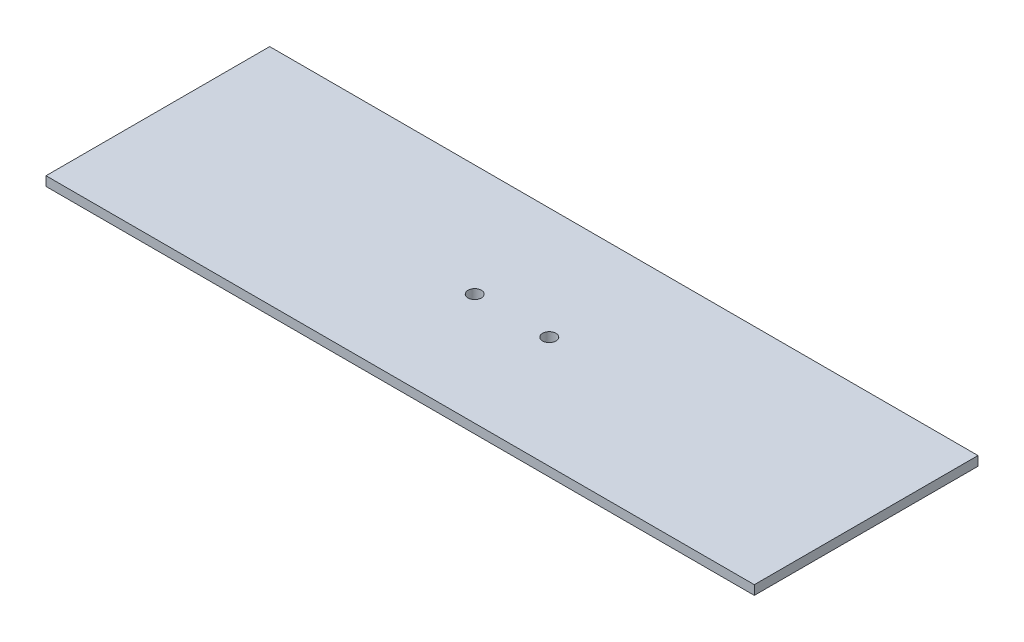
ISO-10303-21;
HEADER;
FILE_DESCRIPTION(('STEP AP214'),'2;1');
FILE_NAME('part.step','',(''),(''),'','','');
FILE_SCHEMA(('AUTOMOTIVE_DESIGN { 1 0 10303 214 1 1 1 1 }'));
ENDSEC;
DATA;
#1=APPLICATION_CONTEXT('core data for automotive mechanical design processes');
#2=APPLICATION_PROTOCOL_DEFINITION('international standard','automotive_design',2000,#1);
#3=PRODUCT_CONTEXT('',#1,'mechanical');
#4=PRODUCT('Part','Part','',(#3));
#5=PRODUCT_RELATED_PRODUCT_CATEGORY('part','',(#4));
#6=PRODUCT_DEFINITION_FORMATION('','',#4);
#7=PRODUCT_DEFINITION_CONTEXT('part definition',#1,'design');
#8=PRODUCT_DEFINITION('design','',#6,#7);
#9=PRODUCT_DEFINITION_SHAPE('','',#8);
#10=(LENGTH_UNIT() NAMED_UNIT(*) SI_UNIT(.MILLI.,.METRE.));
#11=(NAMED_UNIT(*) PLANE_ANGLE_UNIT() SI_UNIT($,.RADIAN.));
#12=(NAMED_UNIT(*) SI_UNIT($,.STERADIAN.) SOLID_ANGLE_UNIT());
#13=UNCERTAINTY_MEASURE_WITH_UNIT(LENGTH_MEASURE(1.E-05),#10,'distance_accuracy_value','');
#14=(GEOMETRIC_REPRESENTATION_CONTEXT(3) GLOBAL_UNCERTAINTY_ASSIGNED_CONTEXT((#13)) GLOBAL_UNIT_ASSIGNED_CONTEXT((#10,
#11,#12)) REPRESENTATION_CONTEXT('',''));
#15=CARTESIAN_POINT('',(0.,0.,0.));
#16=DIRECTION('',(0.,0.,1.));
#17=DIRECTION('',(1.,0.,0.));
#18=AXIS2_PLACEMENT_3D('',#15,#16,#17);
#19=CARTESIAN_POINT('',(0.,3.175,0.));
#20=DIRECTION('',(0.,1.,0.));
#21=DIRECTION('',(0.,0.,1.));
#22=AXIS2_PLACEMENT_3D('',#19,#20,#21);
#23=PLANE('',#22);
#24=CARTESIAN_POINT('',(-12.7,3.175,0.));
#25=DIRECTION('',(0.,1.,0.));
#26=DIRECTION('',(0.,0.,1.));
#27=AXIS2_PLACEMENT_3D('',#24,#25,#26);
#28=CIRCLE('',#27,2.286);
#29=CARTESIAN_POINT('',(-12.7,3.175,2.286));
#30=VERTEX_POINT('',#29);
#31=EDGE_CURVE('E118',#30,#30,#28,.T.);
#32=ORIENTED_EDGE('',*,*,#31,.F.);
#33=EDGE_LOOP('',(#32));
#34=FACE_BOUND('',#33,.T.);
#35=DIRECTION('',(0.,0.,1.));
#36=VECTOR('',#35,1.);
#37=CARTESIAN_POINT('',(-120.65,3.175,38.1));
#38=LINE('',#37,#36);
#39=CARTESIAN_POINT('',(-120.65,3.175,-38.1));
#40=VERTEX_POINT('',#39);
#41=CARTESIAN_POINT('',(-120.65,3.175,38.1));
#42=VERTEX_POINT('',#41);
#43=EDGE_CURVE('E98',#40,#42,#38,.T.);
#44=ORIENTED_EDGE('',*,*,#43,.T.);
#45=DIRECTION('',(1.,0.,0.));
#46=VECTOR('',#45,1.);
#47=CARTESIAN_POINT('',(120.65,3.175,38.1));
#48=LINE('',#47,#46);
#49=CARTESIAN_POINT('',(120.65,3.175,38.1));
#50=VERTEX_POINT('',#49);
#51=EDGE_CURVE('E93',#42,#50,#48,.T.);
#52=ORIENTED_EDGE('',*,*,#51,.T.);
#53=DIRECTION('',(0.,0.,-1.));
#54=VECTOR('',#53,1.);
#55=CARTESIAN_POINT('',(120.65,3.175,38.1));
#56=LINE('',#55,#54);
#57=CARTESIAN_POINT('',(120.65,3.175,-38.1));
#58=VERTEX_POINT('',#57);
#59=EDGE_CURVE('E96',#50,#58,#56,.T.);
#60=ORIENTED_EDGE('',*,*,#59,.T.);
#61=DIRECTION('',(-1.,0.,0.));
#62=VECTOR('',#61,1.);
#63=CARTESIAN_POINT('',(120.65,3.175,-38.1));
#64=LINE('',#63,#62);
#65=EDGE_CURVE('E63',#58,#40,#64,.T.);
#66=ORIENTED_EDGE('',*,*,#65,.T.);
#67=EDGE_LOOP('',(#44,#52,#60,#66));
#68=FACE_BOUND('',#67,.T.);
#69=CARTESIAN_POINT('',(12.7,3.175,0.));
#70=DIRECTION('',(0.,1.,0.));
#71=DIRECTION('',(0.,0.,1.));
#72=AXIS2_PLACEMENT_3D('',#69,#70,#71);
#73=CIRCLE('',#72,2.286);
#74=CARTESIAN_POINT('',(12.7,3.175,2.28599999999999));
#75=VERTEX_POINT('',#74);
#76=EDGE_CURVE('E140',#75,#75,#73,.T.);
#77=ORIENTED_EDGE('',*,*,#76,.F.);
#78=EDGE_LOOP('',(#77));
#79=FACE_BOUND('',#78,.T.);
#80=ADVANCED_FACE('F45',(#34,#68,#79),#23,.T.);
#81=CARTESIAN_POINT('',(0.,0.,0.));
#82=DIRECTION('',(0.,1.,0.));
#83=DIRECTION('',(0.,0.,1.));
#84=AXIS2_PLACEMENT_3D('',#81,#82,#83);
#85=PLANE('',#84);
#86=DIRECTION('',(0.,0.,1.));
#87=VECTOR('',#86,1.);
#88=CARTESIAN_POINT('',(-120.65,0.,38.1));
#89=LINE('',#88,#87);
#90=CARTESIAN_POINT('',(-120.65,0.,-38.1));
#91=VERTEX_POINT('',#90);
#92=CARTESIAN_POINT('',(-120.65,0.,38.1));
#93=VERTEX_POINT('',#92);
#94=EDGE_CURVE('E114',#91,#93,#89,.T.);
#95=ORIENTED_EDGE('',*,*,#94,.F.);
#96=DIRECTION('',(-1.,0.,0.));
#97=VECTOR('',#96,1.);
#98=CARTESIAN_POINT('',(120.65,0.,-38.1));
#99=LINE('',#98,#97);
#100=CARTESIAN_POINT('',(120.65,0.,-38.1));
#101=VERTEX_POINT('',#100);
#102=EDGE_CURVE('E86',#101,#91,#99,.T.);
#103=ORIENTED_EDGE('',*,*,#102,.F.);
#104=DIRECTION('',(0.,0.,-1.));
#105=VECTOR('',#104,1.);
#106=CARTESIAN_POINT('',(120.65,0.,38.1));
#107=LINE('',#106,#105);
#108=CARTESIAN_POINT('',(120.65,0.,38.1));
#109=VERTEX_POINT('',#108);
#110=EDGE_CURVE('E80',#109,#101,#107,.T.);
#111=ORIENTED_EDGE('',*,*,#110,.F.);
#112=DIRECTION('',(1.,0.,0.));
#113=VECTOR('',#112,1.);
#114=CARTESIAN_POINT('',(120.65,0.,38.1));
#115=LINE('',#114,#113);
#116=EDGE_CURVE('E103',#93,#109,#115,.T.);
#117=ORIENTED_EDGE('',*,*,#116,.F.);
#118=EDGE_LOOP('',(#95,#103,#111,#117));
#119=FACE_BOUND('',#118,.T.);
#120=CARTESIAN_POINT('',(-12.7,0.,0.));
#121=DIRECTION('',(0.,1.,0.));
#122=DIRECTION('',(0.,0.,1.));
#123=AXIS2_PLACEMENT_3D('',#120,#121,#122);
#124=CIRCLE('',#123,2.286);
#125=CARTESIAN_POINT('',(-12.7,0.,2.286));
#126=VERTEX_POINT('',#125);
#127=EDGE_CURVE('E136',#126,#126,#124,.T.);
#128=ORIENTED_EDGE('',*,*,#127,.T.);
#129=EDGE_LOOP('',(#128));
#130=FACE_BOUND('',#129,.T.);
#131=CARTESIAN_POINT('',(12.7,0.,0.));
#132=DIRECTION('',(0.,1.,0.));
#133=DIRECTION('',(0.,0.,1.));
#134=AXIS2_PLACEMENT_3D('',#131,#132,#133);
#135=CIRCLE('',#134,2.286);
#136=CARTESIAN_POINT('',(12.7,0.,2.28599999999999));
#137=VERTEX_POINT('',#136);
#138=EDGE_CURVE('E144',#137,#137,#135,.T.);
#139=ORIENTED_EDGE('',*,*,#138,.T.);
#140=EDGE_LOOP('',(#139));
#141=FACE_BOUND('',#140,.T.);
#142=ADVANCED_FACE('F131',(#119,#130,#141),#85,.F.);
#143=CARTESIAN_POINT('',(-120.65,3.175,38.1));
#144=DIRECTION('',(1.,0.,0.));
#145=DIRECTION('',(0.,0.,-1.));
#146=AXIS2_PLACEMENT_3D('',#143,#144,#145);
#147=PLANE('',#146);
#148=ORIENTED_EDGE('',*,*,#94,.T.);
#149=DIRECTION('',(0.,-1.,0.));
#150=VECTOR('',#149,1.);
#151=CARTESIAN_POINT('',(-120.65,3.175,38.1));
#152=LINE('',#151,#150);
#153=EDGE_CURVE('E11',#42,#93,#152,.T.);
#154=ORIENTED_EDGE('',*,*,#153,.F.);
#155=ORIENTED_EDGE('',*,*,#43,.F.);
#156=DIRECTION('',(0.,-1.,0.));
#157=VECTOR('',#156,1.);
#158=CARTESIAN_POINT('',(-120.65,3.175,-38.1));
#159=LINE('',#158,#157);
#160=EDGE_CURVE('E110',#40,#91,#159,.T.);
#161=ORIENTED_EDGE('',*,*,#160,.T.);
#162=EDGE_LOOP('',(#148,#154,#155,#161));
#163=FACE_BOUND('',#162,.T.);
#164=ADVANCED_FACE('F47',(#163),#147,.F.);
#165=CARTESIAN_POINT('',(120.65,3.175,38.1));
#166=DIRECTION('',(0.,0.,-1.));
#167=DIRECTION('',(-1.,0.,0.));
#168=AXIS2_PLACEMENT_3D('',#165,#166,#167);
#169=PLANE('',#168);
#170=ORIENTED_EDGE('',*,*,#116,.T.);
#171=DIRECTION('',(0.,-1.,0.));
#172=VECTOR('',#171,1.);
#173=CARTESIAN_POINT('',(120.65,3.175,38.1));
#174=LINE('',#173,#172);
#175=EDGE_CURVE('E55',#50,#109,#174,.T.);
#176=ORIENTED_EDGE('',*,*,#175,.F.);
#177=ORIENTED_EDGE('',*,*,#51,.F.);
#178=ORIENTED_EDGE('',*,*,#153,.T.);
#179=EDGE_LOOP('',(#170,#176,#177,#178));
#180=FACE_BOUND('',#179,.T.);
#181=ADVANCED_FACE('F102',(#180),#169,.F.);
#182=CARTESIAN_POINT('',(120.65,3.175,38.1));
#183=DIRECTION('',(-1.,0.,0.));
#184=DIRECTION('',(0.,0.,1.));
#185=AXIS2_PLACEMENT_3D('',#182,#183,#184);
#186=PLANE('',#185);
#187=ORIENTED_EDGE('',*,*,#110,.T.);
#188=DIRECTION('',(0.,-1.,0.));
#189=VECTOR('',#188,1.);
#190=CARTESIAN_POINT('',(120.65,3.175,-38.1));
#191=LINE('',#190,#189);
#192=EDGE_CURVE('E105',#58,#101,#191,.T.);
#193=ORIENTED_EDGE('',*,*,#192,.F.);
#194=ORIENTED_EDGE('',*,*,#59,.F.);
#195=ORIENTED_EDGE('',*,*,#175,.T.);
#196=EDGE_LOOP('',(#187,#193,#194,#195));
#197=FACE_BOUND('',#196,.T.);
#198=ADVANCED_FACE('F106',(#197),#186,.F.);
#199=CARTESIAN_POINT('',(120.65,3.175,-38.1));
#200=DIRECTION('',(0.,0.,1.));
#201=DIRECTION('',(1.,0.,0.));
#202=AXIS2_PLACEMENT_3D('',#199,#200,#201);
#203=PLANE('',#202);
#204=ORIENTED_EDGE('',*,*,#102,.T.);
#205=ORIENTED_EDGE('',*,*,#160,.F.);
#206=ORIENTED_EDGE('',*,*,#65,.F.);
#207=ORIENTED_EDGE('',*,*,#192,.T.);
#208=EDGE_LOOP('',(#204,#205,#206,#207));
#209=FACE_BOUND('',#208,.T.);
#210=ADVANCED_FACE('F128',(#209),#203,.F.);
#211=CARTESIAN_POINT('',(-12.7,3.175,0.));
#212=DIRECTION('',(0.,-1.,0.));
#213=DIRECTION('',(0.,0.,-1.));
#214=AXIS2_PLACEMENT_3D('',#211,#212,#213);
#215=CYLINDRICAL_SURFACE('',#214,2.286);
#216=ORIENTED_EDGE('',*,*,#31,.T.);
#217=EDGE_LOOP('',(#216));
#218=FACE_BOUND('',#217,.T.);
#219=ORIENTED_EDGE('',*,*,#127,.F.);
#220=EDGE_LOOP('',(#219));
#221=FACE_BOUND('',#220,.T.);
#222=ADVANCED_FACE('F163',(#218,#221),#215,.F.);
#223=CARTESIAN_POINT('',(12.7,3.175,0.));
#224=DIRECTION('',(0.,-1.,0.));
#225=DIRECTION('',(0.,0.,-1.));
#226=AXIS2_PLACEMENT_3D('',#223,#224,#225);
#227=CYLINDRICAL_SURFACE('',#226,2.286);
#228=ORIENTED_EDGE('',*,*,#76,.T.);
#229=EDGE_LOOP('',(#228));
#230=FACE_BOUND('',#229,.T.);
#231=ORIENTED_EDGE('',*,*,#138,.F.);
#232=EDGE_LOOP('',(#231));
#233=FACE_BOUND('',#232,.T.);
#234=ADVANCED_FACE('F152',(#230,#233),#227,.F.);
#235=CLOSED_SHELL('',(#80,#142,#164,#181,#198,#210,#222,#234));
#236=MANIFOLD_SOLID_BREP('B2',#235);
#237=ADVANCED_BREP_SHAPE_REPRESENTATION('',(#18,#236),#14);
#238=SHAPE_DEFINITION_REPRESENTATION(#9,#237);
ENDSEC;
END-ISO-10303-21;
